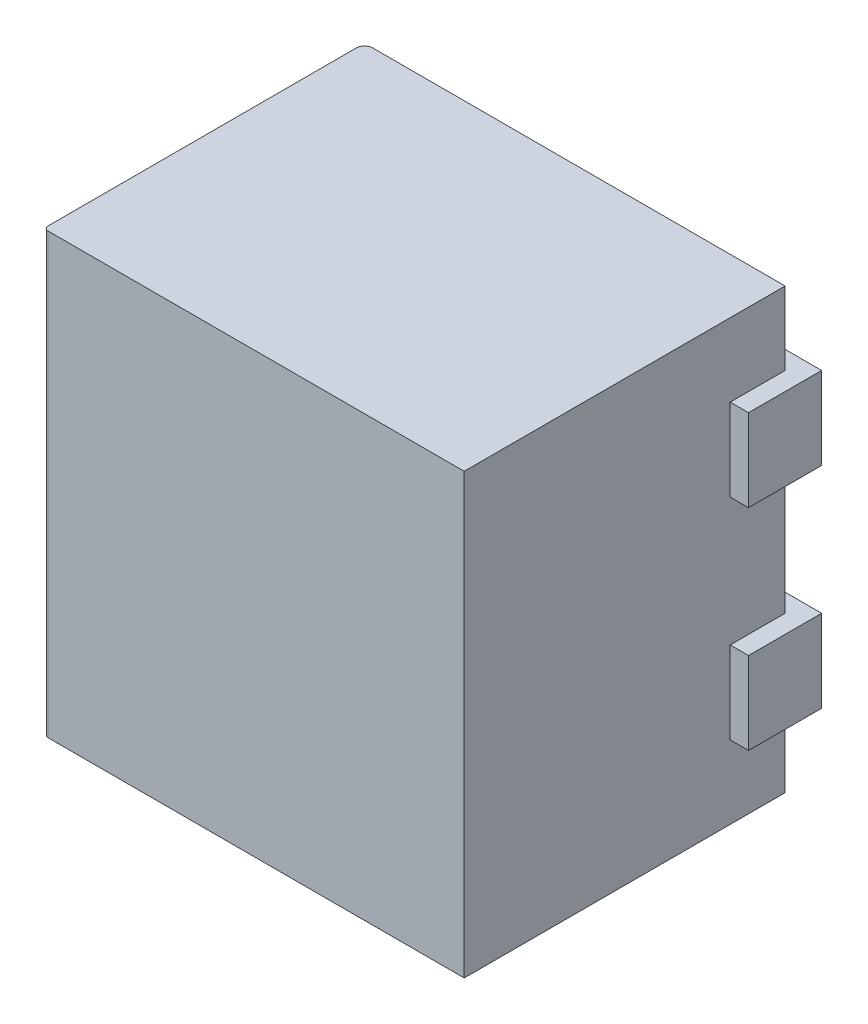
ISO-10303-21;
HEADER;
FILE_DESCRIPTION(('STEP AP214'),'2;1');
FILE_NAME('part.step','',(''),(''),'','','');
FILE_SCHEMA(('AUTOMOTIVE_DESIGN { 1 0 10303 214 1 1 1 1 }'));
ENDSEC;
DATA;
#1=APPLICATION_CONTEXT('core data for automotive mechanical design processes');
#2=APPLICATION_PROTOCOL_DEFINITION('international standard','automotive_design',2000,#1);
#3=PRODUCT_CONTEXT('',#1,'mechanical');
#4=PRODUCT('Part','Part','',(#3));
#5=PRODUCT_RELATED_PRODUCT_CATEGORY('part','',(#4));
#6=PRODUCT_DEFINITION_FORMATION('','',#4);
#7=PRODUCT_DEFINITION_CONTEXT('part definition',#1,'design');
#8=PRODUCT_DEFINITION('design','',#6,#7);
#9=PRODUCT_DEFINITION_SHAPE('','',#8);
#10=(LENGTH_UNIT() NAMED_UNIT(*) SI_UNIT(.MILLI.,.METRE.));
#11=(NAMED_UNIT(*) PLANE_ANGLE_UNIT() SI_UNIT($,.RADIAN.));
#12=(NAMED_UNIT(*) SI_UNIT($,.STERADIAN.) SOLID_ANGLE_UNIT());
#13=UNCERTAINTY_MEASURE_WITH_UNIT(LENGTH_MEASURE(1.E-05),#10,'distance_accuracy_value','');
#14=(GEOMETRIC_REPRESENTATION_CONTEXT(3) GLOBAL_UNCERTAINTY_ASSIGNED_CONTEXT((#13)) GLOBAL_UNIT_ASSIGNED_CONTEXT((#10,
#11,#12)) REPRESENTATION_CONTEXT('',''));
#15=CARTESIAN_POINT('',(0.,0.,0.));
#16=DIRECTION('',(0.,0.,1.));
#17=DIRECTION('',(1.,0.,0.));
#18=AXIS2_PLACEMENT_3D('',#15,#16,#17);
#19=CARTESIAN_POINT('',(-1.8,-1.2,2.6));
#20=DIRECTION('',(-1.,0.,0.));
#21=DIRECTION('',(0.,0.,1.));
#22=AXIS2_PLACEMENT_3D('',#19,#20,#21);
#23=CYLINDRICAL_SURFACE('',#22,0.725);
#24=DIRECTION('',(-1.,0.,0.));
#25=VECTOR('',#24,1.);
#26=CARTESIAN_POINT('',(-1.8,-1.4545718332089,1.92116409807918));
#27=LINE('',#26,#25);
#28=CARTESIAN_POINT('',(-1.8,-1.4545718332089,1.92116409807918));
#29=VERTEX_POINT('',#28);
#30=CARTESIAN_POINT('',(-2.29,-1.4545718332089,1.92116409807918));
#31=VERTEX_POINT('',#30);
#32=EDGE_CURVE('E237',#29,#31,#27,.T.);
#33=ORIENTED_EDGE('',*,*,#32,.T.);
#34=CARTESIAN_POINT('',(-2.29,-1.2,2.6));
#35=DIRECTION('',(-1.,0.,0.));
#36=DIRECTION('',(0.,0.,1.));
#37=AXIS2_PLACEMENT_3D('',#34,#35,#36);
#38=CIRCLE('',#37,0.725);
#39=CARTESIAN_POINT('',(-2.29,-0.521164098079176,2.8545718332089));
#40=VERTEX_POINT('',#39);
#41=EDGE_CURVE('E46',#40,#31,#38,.T.);
#42=ORIENTED_EDGE('',*,*,#41,.F.);
#43=DIRECTION('',(-1.,0.,0.));
#44=VECTOR('',#43,1.);
#45=CARTESIAN_POINT('',(-1.8,-0.521164098079176,2.8545718332089));
#46=LINE('',#45,#44);
#47=CARTESIAN_POINT('',(-1.8,-0.521164098079176,2.8545718332089));
#48=VERTEX_POINT('',#47);
#49=EDGE_CURVE('E235',#48,#40,#46,.T.);
#50=ORIENTED_EDGE('',*,*,#49,.F.);
#51=CARTESIAN_POINT('',(-1.8,-1.2,2.6));
#52=DIRECTION('',(-1.,0.,0.));
#53=DIRECTION('',(0.,0.,1.));
#54=AXIS2_PLACEMENT_3D('',#51,#52,#53);
#55=CIRCLE('',#54,0.725);
#56=EDGE_CURVE('E736',#48,#29,#55,.T.);
#57=ORIENTED_EDGE('',*,*,#56,.T.);
#58=EDGE_LOOP('',(#33,#42,#50,#57));
#59=FACE_BOUND('',#58,.T.);
#60=ADVANCED_FACE('F32',(#59),#23,.T.);
#61=CARTESIAN_POINT('',(-1.8,-1.4545718332089,1.92116409807918));
#62=DIRECTION('',(0.,-0.707106781186547,0.707106781186548));
#63=DIRECTION('',(0.,-0.707106781186548,-0.707106781186547));
#64=AXIS2_PLACEMENT_3D('',#61,#62,#63);
#65=PLANE('',#64);
#66=ORIENTED_EDGE('',*,*,#49,.T.);
#67=DIRECTION('',(0.,-0.707106781186548,-0.707106781186547));
#68=VECTOR('',#67,1.);
#69=CARTESIAN_POINT('',(-2.29,-1.4545718332089,1.92116409807918));
#70=LINE('',#69,#68);
#71=EDGE_CURVE('E225',#40,#31,#70,.T.);
#72=ORIENTED_EDGE('',*,*,#71,.T.);
#73=ORIENTED_EDGE('',*,*,#32,.F.);
#74=DIRECTION('',(0.,0.707106781186548,0.707106781186547));
#75=VECTOR('',#74,1.);
#76=CARTESIAN_POINT('',(-1.8,-1.4545718332089,1.92116409807918));
#77=LINE('',#76,#75);
#78=EDGE_CURVE('E241',#29,#48,#77,.T.);
#79=ORIENTED_EDGE('',*,*,#78,.T.);
#80=EDGE_LOOP('',(#66,#72,#73,#79));
#81=FACE_BOUND('',#80,.T.);
#82=ADVANCED_FACE('F239',(#81),#65,.T.);
#83=CARTESIAN_POINT('',(-1.8,-1.2,2.6));
#84=DIRECTION('',(-1.,0.,0.));
#85=DIRECTION('',(0.,0.,1.));
#86=AXIS2_PLACEMENT_3D('',#83,#84,#85);
#87=CYLINDRICAL_SURFACE('',#86,0.725);
#88=DIRECTION('',(-1.,0.,0.));
#89=VECTOR('',#88,1.);
#90=CARTESIAN_POINT('',(-1.8,-0.945428166791108,3.27883590192083));
#91=LINE('',#90,#89);
#92=CARTESIAN_POINT('',(-1.8,-0.945428166791108,3.27883590192083));
#93=VERTEX_POINT('',#92);
#94=CARTESIAN_POINT('',(-2.29,-0.945428166791108,3.27883590192083));
#95=VERTEX_POINT('',#94);
#96=EDGE_CURVE('E737',#93,#95,#91,.T.);
#97=ORIENTED_EDGE('',*,*,#96,.T.);
#98=CARTESIAN_POINT('',(-2.29,-1.87883590192083,2.34542816679111));
#99=VERTEX_POINT('',#98);
#100=EDGE_CURVE('E53',#99,#95,#38,.T.);
#101=ORIENTED_EDGE('',*,*,#100,.F.);
#102=DIRECTION('',(-1.,0.,0.));
#103=VECTOR('',#102,1.);
#104=CARTESIAN_POINT('',(-1.8,-1.87883590192083,2.34542816679111));
#105=LINE('',#104,#103);
#106=CARTESIAN_POINT('',(-1.8,-1.87883590192083,2.34542816679111));
#107=VERTEX_POINT('',#106);
#108=EDGE_CURVE('E731',#107,#99,#105,.T.);
#109=ORIENTED_EDGE('',*,*,#108,.F.);
#110=CARTESIAN_POINT('',(-1.8,-1.2,2.6));
#111=DIRECTION('',(-1.,0.,0.));
#112=DIRECTION('',(0.,0.,1.));
#113=AXIS2_PLACEMENT_3D('',#110,#111,#112);
#114=CIRCLE('',#113,0.725);
#115=EDGE_CURVE('E230',#107,#93,#114,.T.);
#116=ORIENTED_EDGE('',*,*,#115,.T.);
#117=EDGE_LOOP('',(#97,#101,#109,#116));
#118=FACE_BOUND('',#117,.T.);
#119=ADVANCED_FACE('F550',(#118),#87,.T.);
#120=CARTESIAN_POINT('',(-1.8,-1.87883590192083,2.34542816679111));
#121=DIRECTION('',(0.,0.707106781186547,-0.707106781186548));
#122=DIRECTION('',(0.,0.707106781186548,0.707106781186547));
#123=AXIS2_PLACEMENT_3D('',#120,#121,#122);
#124=PLANE('',#123);
#125=ORIENTED_EDGE('',*,*,#108,.T.);
#126=DIRECTION('',(0.,0.707106781186548,0.707106781186547));
#127=VECTOR('',#126,1.);
#128=CARTESIAN_POINT('',(-2.29,-1.87883590192083,2.34542816679111));
#129=LINE('',#128,#127);
#130=EDGE_CURVE('E11',#99,#95,#129,.T.);
#131=ORIENTED_EDGE('',*,*,#130,.T.);
#132=ORIENTED_EDGE('',*,*,#96,.F.);
#133=DIRECTION('',(0.,-0.707106781186548,-0.707106781186547));
#134=VECTOR('',#133,1.);
#135=CARTESIAN_POINT('',(-1.8,-1.87883590192083,2.34542816679111));
#136=LINE('',#135,#134);
#137=EDGE_CURVE('E734',#93,#107,#136,.T.);
#138=ORIENTED_EDGE('',*,*,#137,.T.);
#139=EDGE_LOOP('',(#125,#131,#132,#138));
#140=FACE_BOUND('',#139,.T.);
#141=ADVANCED_FACE('F649',(#140),#124,.T.);
#142=CARTESIAN_POINT('',(-2.25,2.4,3.46));
#143=DIRECTION('',(0.,-1.,0.));
#144=DIRECTION('',(0.,0.,-1.));
#145=AXIS2_PLACEMENT_3D('',#142,#143,#144);
#146=CYLINDRICAL_SURFACE('',#145,0.05);
#147=DIRECTION('',(0.,-1.,0.));
#148=VECTOR('',#147,1.);
#149=CARTESIAN_POINT('',(-2.25,2.4,3.51));
#150=LINE('',#149,#148);
#151=CARTESIAN_POINT('',(-2.25,2.4,3.51));
#152=VERTEX_POINT('',#151);
#153=CARTESIAN_POINT('',(-2.25,-2.4,3.51));
#154=VERTEX_POINT('',#153);
#155=EDGE_CURVE('E436',#152,#154,#150,.T.);
#156=ORIENTED_EDGE('',*,*,#155,.F.);
#157=CARTESIAN_POINT('',(-2.25,2.4,3.46));
#158=DIRECTION('',(0.,-1.,0.));
#159=DIRECTION('',(0.,0.,-1.));
#160=AXIS2_PLACEMENT_3D('',#157,#158,#159);
#161=CIRCLE('',#160,0.05);
#162=CARTESIAN_POINT('',(-2.3,2.4,3.46));
#163=VERTEX_POINT('',#162);
#164=EDGE_CURVE('E442',#163,#152,#161,.F.);
#165=ORIENTED_EDGE('',*,*,#164,.F.);
#166=DIRECTION('',(0.,-1.,0.));
#167=VECTOR('',#166,1.);
#168=CARTESIAN_POINT('',(-2.3,-2.4,3.46));
#169=LINE('',#168,#167);
#170=CARTESIAN_POINT('',(-2.3,-2.4,3.46));
#171=VERTEX_POINT('',#170);
#172=EDGE_CURVE('E439',#171,#163,#169,.F.);
#173=ORIENTED_EDGE('',*,*,#172,.F.);
#174=CARTESIAN_POINT('',(-2.25,-2.4,3.46));
#175=DIRECTION('',(0.,1.,0.));
#176=DIRECTION('',(0.,0.,1.));
#177=AXIS2_PLACEMENT_3D('',#174,#175,#176);
#178=CIRCLE('',#177,0.05);
#179=EDGE_CURVE('E40',#154,#171,#178,.F.);
#180=ORIENTED_EDGE('',*,*,#179,.F.);
#181=EDGE_LOOP('',(#156,#165,#173,#180));
#182=FACE_BOUND('',#181,.T.);
#183=ADVANCED_FACE('F34',(#182),#146,.T.);
#184=CARTESIAN_POINT('',(-2.35,0.65,-0.05));
#185=DIRECTION('',(0.,-1.,0.));
#186=DIRECTION('',(0.,0.,-1.));
#187=AXIS2_PLACEMENT_3D('',#184,#185,#186);
#188=CYLINDRICAL_SURFACE('',#187,0.15);
#189=DIRECTION('',(0.,1.,0.));
#190=VECTOR('',#189,1.);
#191=CARTESIAN_POINT('',(-2.35,0.65,-0.2));
#192=LINE('',#191,#190);
#193=CARTESIAN_POINT('',(-2.35,-0.65,-0.2));
#194=VERTEX_POINT('',#193);
#195=CARTESIAN_POINT('',(-2.35,0.65,-0.2));
#196=VERTEX_POINT('',#195);
#197=EDGE_CURVE('E426',#194,#196,#192,.T.);
#198=ORIENTED_EDGE('',*,*,#197,.F.);
#199=CARTESIAN_POINT('',(-2.35,-0.65,-0.05));
#200=DIRECTION('',(0.,1.,0.));
#201=DIRECTION('',(0.,0.,1.));
#202=AXIS2_PLACEMENT_3D('',#199,#200,#201);
#203=CIRCLE('',#202,0.15);
#204=CARTESIAN_POINT('',(-2.5,-0.65,-0.0499999999999997));
#205=VERTEX_POINT('',#204);
#206=EDGE_CURVE('E432',#205,#194,#203,.F.);
#207=ORIENTED_EDGE('',*,*,#206,.F.);
#208=DIRECTION('',(0.,1.,0.));
#209=VECTOR('',#208,1.);
#210=CARTESIAN_POINT('',(-2.5,0.65,-0.05));
#211=LINE('',#210,#209);
#212=CARTESIAN_POINT('',(-2.5,0.65,-0.0499999999999997));
#213=VERTEX_POINT('',#212);
#214=EDGE_CURVE('E429',#213,#205,#211,.F.);
#215=ORIENTED_EDGE('',*,*,#214,.F.);
#216=CARTESIAN_POINT('',(-2.35,0.65,-0.05));
#217=DIRECTION('',(0.,-1.,0.));
#218=DIRECTION('',(0.,0.,-1.));
#219=AXIS2_PLACEMENT_3D('',#216,#217,#218);
#220=CIRCLE('',#219,0.15);
#221=EDGE_CURVE('E434',#196,#213,#220,.F.);
#222=ORIENTED_EDGE('',*,*,#221,.F.);
#223=EDGE_LOOP('',(#198,#207,#215,#222));
#224=FACE_BOUND('',#223,.T.);
#225=ADVANCED_FACE('F532',(#224),#188,.T.);
#226=CARTESIAN_POINT('',(-2.3,2.4,0.));
#227=DIRECTION('',(0.,0.,-1.));
#228=DIRECTION('',(-1.,0.,0.));
#229=AXIS2_PLACEMENT_3D('',#226,#227,#228);
#230=PLANE('',#229);
#231=DIRECTION('',(0.,-1.,0.));
#232=VECTOR('',#231,1.);
#233=CARTESIAN_POINT('',(1.5,2.4,0.));
#234=LINE('',#233,#232);
#235=CARTESIAN_POINT('',(1.5,-0.7,0.));
#236=VERTEX_POINT('',#235);
#237=CARTESIAN_POINT('',(1.5,-1.6,0.));
#238=VERTEX_POINT('',#237);
#239=EDGE_CURVE('E424',#236,#238,#234,.T.);
#240=ORIENTED_EDGE('',*,*,#239,.T.);
#241=DIRECTION('',(1.,0.,0.));
#242=VECTOR('',#241,1.);
#243=CARTESIAN_POINT('',(-2.3,-1.6,0.));
#244=LINE('',#243,#242);
#245=CARTESIAN_POINT('',(2.3,-1.6,0.));
#246=VERTEX_POINT('',#245);
#247=EDGE_CURVE('E282',#238,#246,#244,.T.);
#248=ORIENTED_EDGE('',*,*,#247,.T.);
#249=DIRECTION('',(0.,1.,0.));
#250=VECTOR('',#249,1.);
#251=CARTESIAN_POINT('',(2.3,2.4,0.));
#252=LINE('',#251,#250);
#253=CARTESIAN_POINT('',(2.3,-2.4,0.));
#254=VERTEX_POINT('',#253);
#255=EDGE_CURVE('E365',#254,#246,#252,.T.);
#256=ORIENTED_EDGE('',*,*,#255,.F.);
#257=DIRECTION('',(1.,0.,0.));
#258=VECTOR('',#257,1.);
#259=CARTESIAN_POINT('',(2.3,-2.4,0.));
#260=LINE('',#259,#258);
#261=CARTESIAN_POINT('',(-2.21,-2.4,0.));
#262=VERTEX_POINT('',#261);
#263=EDGE_CURVE('E353',#262,#254,#260,.T.);
#264=ORIENTED_EDGE('',*,*,#263,.F.);
#265=DIRECTION('',(0.,1.,0.));
#266=VECTOR('',#265,1.);
#267=CARTESIAN_POINT('',(-2.21,2.4,0.));
#268=LINE('',#267,#266);
#269=CARTESIAN_POINT('',(-2.21,-0.65,0.));
#270=VERTEX_POINT('',#269);
#271=EDGE_CURVE('E381',#262,#270,#268,.T.);
#272=ORIENTED_EDGE('',*,*,#271,.T.);
#273=DIRECTION('',(1.,0.,0.));
#274=VECTOR('',#273,1.);
#275=CARTESIAN_POINT('',(-2.3,-0.65,0.));
#276=LINE('',#275,#274);
#277=CARTESIAN_POINT('',(-1.36,-0.65,0.));
#278=VERTEX_POINT('',#277);
#279=EDGE_CURVE('E399',#270,#278,#276,.T.);
#280=ORIENTED_EDGE('',*,*,#279,.T.);
#281=DIRECTION('',(0.,1.,0.));
#282=VECTOR('',#281,1.);
#283=CARTESIAN_POINT('',(-1.36,2.4,0.));
#284=LINE('',#283,#282);
#285=CARTESIAN_POINT('',(-1.36,0.65,0.));
#286=VERTEX_POINT('',#285);
#287=EDGE_CURVE('E396',#278,#286,#284,.T.);
#288=ORIENTED_EDGE('',*,*,#287,.T.);
#289=DIRECTION('',(-1.,0.,0.));
#290=VECTOR('',#289,1.);
#291=CARTESIAN_POINT('',(-2.3,0.65,0.));
#292=LINE('',#291,#290);
#293=CARTESIAN_POINT('',(-2.21,0.65,0.));
#294=VERTEX_POINT('',#293);
#295=EDGE_CURVE('E393',#286,#294,#292,.T.);
#296=ORIENTED_EDGE('',*,*,#295,.T.);
#297=CARTESIAN_POINT('',(-2.21,2.4,0.));
#298=VERTEX_POINT('',#297);
#299=EDGE_CURVE('E380',#294,#298,#268,.T.);
#300=ORIENTED_EDGE('',*,*,#299,.T.);
#301=DIRECTION('',(-1.,0.,0.));
#302=VECTOR('',#301,1.);
#303=CARTESIAN_POINT('',(-2.3,2.4,0.));
#304=LINE('',#303,#302);
#305=CARTESIAN_POINT('',(2.3,2.4,0.));
#306=VERTEX_POINT('',#305);
#307=EDGE_CURVE('E357',#306,#298,#304,.T.);
#308=ORIENTED_EDGE('',*,*,#307,.F.);
#309=CARTESIAN_POINT('',(2.3,1.6,0.));
#310=VERTEX_POINT('',#309);
#311=EDGE_CURVE('E364',#310,#306,#252,.T.);
#312=ORIENTED_EDGE('',*,*,#311,.F.);
#313=DIRECTION('',(-1.,0.,0.));
#314=VECTOR('',#313,1.);
#315=CARTESIAN_POINT('',(-2.3,1.6,0.));
#316=LINE('',#315,#314);
#317=CARTESIAN_POINT('',(1.5,1.6,0.));
#318=VERTEX_POINT('',#317);
#319=EDGE_CURVE('E311',#310,#318,#316,.T.);
#320=ORIENTED_EDGE('',*,*,#319,.T.);
#321=DIRECTION('',(0.,-1.,0.));
#322=VECTOR('',#321,1.);
#323=CARTESIAN_POINT('',(1.5,2.4,0.));
#324=LINE('',#323,#322);
#325=CARTESIAN_POINT('',(1.5,0.7,0.));
#326=VERTEX_POINT('',#325);
#327=EDGE_CURVE('E413',#318,#326,#324,.T.);
#328=ORIENTED_EDGE('',*,*,#327,.T.);
#329=DIRECTION('',(1.,0.,0.));
#330=VECTOR('',#329,1.);
#331=CARTESIAN_POINT('',(-2.3,0.7,0.));
#332=LINE('',#331,#330);
#333=CARTESIAN_POINT('',(2.3,0.7,0.));
#334=VERTEX_POINT('',#333);
#335=EDGE_CURVE('E313',#326,#334,#332,.T.);
#336=ORIENTED_EDGE('',*,*,#335,.T.);
#337=CARTESIAN_POINT('',(2.3,-0.7,0.));
#338=VERTEX_POINT('',#337);
#339=EDGE_CURVE('E368',#338,#334,#252,.T.);
#340=ORIENTED_EDGE('',*,*,#339,.F.);
#341=DIRECTION('',(-1.,0.,0.));
#342=VECTOR('',#341,1.);
#343=CARTESIAN_POINT('',(-2.3,-0.7,0.));
#344=LINE('',#343,#342);
#345=EDGE_CURVE('E280',#338,#236,#344,.T.);
#346=ORIENTED_EDGE('',*,*,#345,.T.);
#347=EDGE_LOOP('',(#240,#248,#256,#264,#272,#280,#288,#296,#300,#308,#312,#320,#328,#336,#340,#346));
#348=FACE_BOUND('',#347,.T.);
#349=ADVANCED_FACE('F469',(#348),#230,.T.);
#350=CARTESIAN_POINT('',(2.3,2.4,3.51));
#351=DIRECTION('',(-1.,0.,0.));
#352=DIRECTION('',(0.,0.,1.));
#353=AXIS2_PLACEMENT_3D('',#350,#351,#352);
#354=PLANE('',#353);
#355=DIRECTION('',(0.,0.,-1.));
#356=VECTOR('',#355,1.);
#357=CARTESIAN_POINT('',(2.3,-1.6,3.51));
#358=LINE('',#357,#356);
#359=CARTESIAN_POINT('',(2.3,-1.6,0.6));
#360=VERTEX_POINT('',#359);
#361=EDGE_CURVE('E421',#360,#246,#358,.T.);
#362=ORIENTED_EDGE('',*,*,#361,.F.);
#363=DIRECTION('',(0.,-1.,0.));
#364=VECTOR('',#363,1.);
#365=CARTESIAN_POINT('',(2.3,2.4,0.6));
#366=LINE('',#365,#364);
#367=CARTESIAN_POINT('',(2.3,-0.7,0.6));
#368=VERTEX_POINT('',#367);
#369=EDGE_CURVE('E415',#368,#360,#366,.T.);
#370=ORIENTED_EDGE('',*,*,#369,.F.);
#371=DIRECTION('',(0.,0.,1.));
#372=VECTOR('',#371,1.);
#373=CARTESIAN_POINT('',(2.3,-0.7,3.51));
#374=LINE('',#373,#372);
#375=EDGE_CURVE('E418',#338,#368,#374,.T.);
#376=ORIENTED_EDGE('',*,*,#375,.F.);
#377=ORIENTED_EDGE('',*,*,#339,.T.);
#378=DIRECTION('',(0.,0.,-1.));
#379=VECTOR('',#378,1.);
#380=CARTESIAN_POINT('',(2.3,0.7,3.51));
#381=LINE('',#380,#379);
#382=CARTESIAN_POINT('',(2.3,0.7,0.6));
#383=VERTEX_POINT('',#382);
#384=EDGE_CURVE('E410',#383,#334,#381,.T.);
#385=ORIENTED_EDGE('',*,*,#384,.F.);
#386=DIRECTION('',(0.,-1.,0.));
#387=VECTOR('',#386,1.);
#388=CARTESIAN_POINT('',(2.3,2.4,0.6));
#389=LINE('',#388,#387);
#390=CARTESIAN_POINT('',(2.3,1.6,0.6));
#391=VERTEX_POINT('',#390);
#392=EDGE_CURVE('E404',#391,#383,#389,.T.);
#393=ORIENTED_EDGE('',*,*,#392,.F.);
#394=DIRECTION('',(0.,0.,1.));
#395=VECTOR('',#394,1.);
#396=CARTESIAN_POINT('',(2.3,1.6,3.51));
#397=LINE('',#396,#395);
#398=EDGE_CURVE('E407',#310,#391,#397,.T.);
#399=ORIENTED_EDGE('',*,*,#398,.F.);
#400=ORIENTED_EDGE('',*,*,#311,.T.);
#401=DIRECTION('',(0.,0.,-1.));
#402=VECTOR('',#401,1.);
#403=CARTESIAN_POINT('',(2.3,2.4,3.51));
#404=LINE('',#403,#402);
#405=CARTESIAN_POINT('',(2.3,2.4,3.51));
#406=VERTEX_POINT('',#405);
#407=EDGE_CURVE('E372',#406,#306,#404,.T.);
#408=ORIENTED_EDGE('',*,*,#407,.F.);
#409=DIRECTION('',(0.,1.,0.));
#410=VECTOR('',#409,1.);
#411=CARTESIAN_POINT('',(2.3,2.4,3.51));
#412=LINE('',#411,#410);
#413=CARTESIAN_POINT('',(2.3,-2.4,3.51));
#414=VERTEX_POINT('',#413);
#415=EDGE_CURVE('E356',#414,#406,#412,.T.);
#416=ORIENTED_EDGE('',*,*,#415,.F.);
#417=DIRECTION('',(0.,0.,-1.));
#418=VECTOR('',#417,1.);
#419=CARTESIAN_POINT('',(2.3,-2.4,3.51));
#420=LINE('',#419,#418);
#421=EDGE_CURVE('E375',#414,#254,#420,.T.);
#422=ORIENTED_EDGE('',*,*,#421,.T.);
#423=ORIENTED_EDGE('',*,*,#255,.T.);
#424=EDGE_LOOP('',(#362,#370,#376,#377,#385,#393,#399,#400,#408,#416,#422,#423));
#425=FACE_BOUND('',#424,.T.);
#426=ADVANCED_FACE('F467',(#425),#354,.F.);
#427=CARTESIAN_POINT('',(-2.21,2.4,0.09));
#428=DIRECTION('',(0.,-1.,0.));
#429=DIRECTION('',(0.,0.,-1.));
#430=AXIS2_PLACEMENT_3D('',#427,#428,#429);
#431=CYLINDRICAL_SURFACE('',#430,0.09);
#432=DIRECTION('',(0.,1.,0.));
#433=VECTOR('',#432,1.);
#434=CARTESIAN_POINT('',(-2.3,2.4,0.09));
#435=LINE('',#434,#433);
#436=CARTESIAN_POINT('',(-2.3,-0.65,0.0900000000000002));
#437=VERTEX_POINT('',#436);
#438=CARTESIAN_POINT('',(-2.3,-2.4,0.0900000000000002));
#439=VERTEX_POINT('',#438);
#440=EDGE_CURVE('E384',#437,#439,#435,.F.);
#441=ORIENTED_EDGE('',*,*,#440,.F.);
#442=CARTESIAN_POINT('',(-2.21,-0.65,0.09));
#443=DIRECTION('',(0.,1.,0.));
#444=DIRECTION('',(0.,0.,1.));
#445=AXIS2_PLACEMENT_3D('',#442,#443,#444);
#446=CIRCLE('',#445,0.09);
#447=EDGE_CURVE('E348',#437,#270,#446,.F.);
#448=ORIENTED_EDGE('',*,*,#447,.T.);
#449=ORIENTED_EDGE('',*,*,#271,.F.);
#450=CARTESIAN_POINT('',(-2.21,-2.4,0.09));
#451=DIRECTION('',(0.,1.,0.));
#452=DIRECTION('',(0.,0.,1.));
#453=AXIS2_PLACEMENT_3D('',#450,#451,#452);
#454=CIRCLE('',#453,0.09);
#455=EDGE_CURVE('E388',#439,#262,#454,.F.);
#456=ORIENTED_EDGE('',*,*,#455,.F.);
#457=EDGE_LOOP('',(#441,#448,#449,#456));
#458=FACE_BOUND('',#457,.T.);
#459=ADVANCED_FACE('F461',(#458),#431,.T.);
#460=ORIENTED_EDGE('',*,*,#299,.F.);
#461=CARTESIAN_POINT('',(-2.21,0.65,0.09));
#462=DIRECTION('',(0.,-1.,0.));
#463=DIRECTION('',(0.,0.,-1.));
#464=AXIS2_PLACEMENT_3D('',#461,#462,#463);
#465=CIRCLE('',#464,0.09);
#466=CARTESIAN_POINT('',(-2.3,0.65,0.0900000000000002));
#467=VERTEX_POINT('',#466);
#468=EDGE_CURVE('E343',#294,#467,#465,.F.);
#469=ORIENTED_EDGE('',*,*,#468,.T.);
#470=CARTESIAN_POINT('',(-2.3,2.4,0.0900000000000002));
#471=VERTEX_POINT('',#470);
#472=EDGE_CURVE('E385',#471,#467,#435,.F.);
#473=ORIENTED_EDGE('',*,*,#472,.F.);
#474=CARTESIAN_POINT('',(-2.21,2.4,0.09));
#475=DIRECTION('',(0.,-1.,0.));
#476=DIRECTION('',(0.,0.,-1.));
#477=AXIS2_PLACEMENT_3D('',#474,#475,#476);
#478=CIRCLE('',#477,0.09);
#479=EDGE_CURVE('E390',#298,#471,#478,.F.);
#480=ORIENTED_EDGE('',*,*,#479,.F.);
#481=EDGE_LOOP('',(#460,#469,#473,#480));
#482=FACE_BOUND('',#481,.T.);
#483=ADVANCED_FACE('F508',(#482),#431,.T.);
#484=CARTESIAN_POINT('',(-2.3,-2.4,3.51));
#485=DIRECTION('',(1.,0.,0.));
#486=DIRECTION('',(0.,0.,-1.));
#487=AXIS2_PLACEMENT_3D('',#484,#485,#486);
#488=PLANE('',#487);
#489=CARTESIAN_POINT('',(-2.3,-1.2,2.6));
#490=DIRECTION('',(-1.,0.,0.));
#491=DIRECTION('',(0.,0.,1.));
#492=AXIS2_PLACEMENT_3D('',#489,#490,#491);
#493=CIRCLE('',#492,0.75);
#494=CARTESIAN_POINT('',(-2.3,-1.2,3.35));
#495=VERTEX_POINT('',#494);
#496=EDGE_CURVE('E242',#495,#495,#493,.T.);
#497=ORIENTED_EDGE('',*,*,#496,.F.);
#498=EDGE_LOOP('',(#497));
#499=FACE_BOUND('',#498,.T.);
#500=DIRECTION('',(0.,0.,-1.));
#501=VECTOR('',#500,1.);
#502=CARTESIAN_POINT('',(-2.3,-2.4,3.51));
#503=LINE('',#502,#501);
#504=EDGE_CURVE('E378',#171,#439,#503,.T.);
#505=ORIENTED_EDGE('',*,*,#504,.F.);
#506=ORIENTED_EDGE('',*,*,#172,.T.);
#507=DIRECTION('',(0.,0.,-1.));
#508=VECTOR('',#507,1.);
#509=CARTESIAN_POINT('',(-2.3,2.4,3.51));
#510=LINE('',#509,#508);
#511=EDGE_CURVE('E362',#163,#471,#510,.T.);
#512=ORIENTED_EDGE('',*,*,#511,.T.);
#513=ORIENTED_EDGE('',*,*,#472,.T.);
#514=DIRECTION('',(0.,0.,-1.));
#515=VECTOR('',#514,1.);
#516=CARTESIAN_POINT('',(-2.3,0.65,3.51));
#517=LINE('',#516,#515);
#518=CARTESIAN_POINT('',(-2.3,0.65,0.6));
#519=VERTEX_POINT('',#518);
#520=EDGE_CURVE('E346',#519,#467,#517,.T.);
#521=ORIENTED_EDGE('',*,*,#520,.F.);
#522=DIRECTION('',(0.,1.,0.));
#523=VECTOR('',#522,1.);
#524=CARTESIAN_POINT('',(-2.3,-2.4,0.6));
#525=LINE('',#524,#523);
#526=CARTESIAN_POINT('',(-2.3,-0.65,0.6));
#527=VERTEX_POINT('',#526);
#528=EDGE_CURVE('E402',#527,#519,#525,.T.);
#529=ORIENTED_EDGE('',*,*,#528,.F.);
#530=DIRECTION('',(0.,0.,1.));
#531=VECTOR('',#530,1.);
#532=CARTESIAN_POINT('',(-2.3,-0.65,3.51));
#533=LINE('',#532,#531);
#534=EDGE_CURVE('E351',#437,#527,#533,.T.);
#535=ORIENTED_EDGE('',*,*,#534,.F.);
#536=ORIENTED_EDGE('',*,*,#440,.T.);
#537=EDGE_LOOP('',(#505,#506,#512,#513,#521,#529,#535,#536));
#538=FACE_BOUND('',#537,.T.);
#539=ADVANCED_FACE('F454',(#499,#538),#488,.F.);
#540=CARTESIAN_POINT('',(2.3,-2.4,3.51));
#541=DIRECTION('',(0.,1.,0.));
#542=DIRECTION('',(0.,0.,1.));
#543=AXIS2_PLACEMENT_3D('',#540,#541,#542);
#544=PLANE('',#543);
#545=DIRECTION('',(1.,0.,0.));
#546=VECTOR('',#545,1.);
#547=CARTESIAN_POINT('',(2.3,-2.4,3.51));
#548=LINE('',#547,#546);
#549=EDGE_CURVE('E354',#154,#414,#548,.T.);
#550=ORIENTED_EDGE('',*,*,#549,.F.);
#551=ORIENTED_EDGE('',*,*,#179,.T.);
#552=ORIENTED_EDGE('',*,*,#504,.T.);
#553=ORIENTED_EDGE('',*,*,#455,.T.);
#554=ORIENTED_EDGE('',*,*,#263,.T.);
#555=ORIENTED_EDGE('',*,*,#421,.F.);
#556=EDGE_LOOP('',(#550,#551,#552,#553,#554,#555));
#557=FACE_BOUND('',#556,.T.);
#558=ADVANCED_FACE('F446',(#557),#544,.F.);
#559=CARTESIAN_POINT('',(-2.3,2.4,3.51));
#560=DIRECTION('',(0.,-1.,0.));
#561=DIRECTION('',(0.,0.,-1.));
#562=AXIS2_PLACEMENT_3D('',#559,#560,#561);
#563=PLANE('',#562);
#564=ORIENTED_EDGE('',*,*,#511,.F.);
#565=ORIENTED_EDGE('',*,*,#164,.T.);
#566=DIRECTION('',(-1.,0.,0.));
#567=VECTOR('',#566,1.);
#568=CARTESIAN_POINT('',(-2.3,2.4,3.51));
#569=LINE('',#568,#567);
#570=EDGE_CURVE('E359',#406,#152,#569,.T.);
#571=ORIENTED_EDGE('',*,*,#570,.F.);
#572=ORIENTED_EDGE('',*,*,#407,.T.);
#573=ORIENTED_EDGE('',*,*,#307,.T.);
#574=ORIENTED_EDGE('',*,*,#479,.T.);
#575=EDGE_LOOP('',(#564,#565,#571,#572,#573,#574));
#576=FACE_BOUND('',#575,.T.);
#577=ADVANCED_FACE('F503',(#576),#563,.F.);
#578=CARTESIAN_POINT('',(-2.3,2.4,3.51));
#579=DIRECTION('',(0.,0.,-1.));
#580=DIRECTION('',(-1.,0.,0.));
#581=AXIS2_PLACEMENT_3D('',#578,#579,#580);
#582=PLANE('',#581);
#583=ORIENTED_EDGE('',*,*,#570,.T.);
#584=ORIENTED_EDGE('',*,*,#155,.T.);
#585=ORIENTED_EDGE('',*,*,#549,.T.);
#586=ORIENTED_EDGE('',*,*,#415,.T.);
#587=EDGE_LOOP('',(#583,#584,#585,#586));
#588=FACE_BOUND('',#587,.T.);
#589=ADVANCED_FACE('F601',(#588),#582,.F.);
#590=CARTESIAN_POINT('',(-2.5,0.65,0.6));
#591=DIRECTION('',(0.,0.,-1.));
#592=DIRECTION('',(-1.,0.,0.));
#593=AXIS2_PLACEMENT_3D('',#590,#591,#592);
#594=PLANE('',#593);
#595=DIRECTION('',(1.,0.,0.));
#596=VECTOR('',#595,1.);
#597=CARTESIAN_POINT('',(-1.36,-0.65,0.6));
#598=LINE('',#597,#596);
#599=CARTESIAN_POINT('',(-2.5,-0.65,0.6));
#600=VERTEX_POINT('',#599);
#601=EDGE_CURVE('E320',#600,#527,#598,.T.);
#602=ORIENTED_EDGE('',*,*,#601,.T.);
#603=ORIENTED_EDGE('',*,*,#528,.T.);
#604=DIRECTION('',(-1.,0.,0.));
#605=VECTOR('',#604,1.);
#606=CARTESIAN_POINT('',(-2.5,0.65,0.6));
#607=LINE('',#606,#605);
#608=CARTESIAN_POINT('',(-2.5,0.65,0.6));
#609=VERTEX_POINT('',#608);
#610=EDGE_CURVE('E324',#519,#609,#607,.T.);
#611=ORIENTED_EDGE('',*,*,#610,.T.);
#612=DIRECTION('',(0.,-1.,0.));
#613=VECTOR('',#612,1.);
#614=CARTESIAN_POINT('',(-2.5,-0.65,0.6));
#615=LINE('',#614,#613);
#616=EDGE_CURVE('E317',#609,#600,#615,.T.);
#617=ORIENTED_EDGE('',*,*,#616,.T.);
#618=EDGE_LOOP('',(#602,#603,#611,#617));
#619=FACE_BOUND('',#618,.T.);
#620=ADVANCED_FACE('F516',(#619),#594,.F.);
#621=CARTESIAN_POINT('',(-1.36,-0.65,0.6));
#622=DIRECTION('',(0.,1.,0.));
#623=DIRECTION('',(0.,0.,1.));
#624=AXIS2_PLACEMENT_3D('',#621,#622,#623);
#625=PLANE('',#624);
#626=DIRECTION('',(0.,0.,-1.));
#627=VECTOR('',#626,1.);
#628=CARTESIAN_POINT('',(-2.5,-0.65,0.6));
#629=LINE('',#628,#627);
#630=EDGE_CURVE('E340',#600,#205,#629,.T.);
#631=ORIENTED_EDGE('',*,*,#630,.T.);
#632=ORIENTED_EDGE('',*,*,#206,.T.);
#633=DIRECTION('',(1.,0.,0.));
#634=VECTOR('',#633,1.);
#635=CARTESIAN_POINT('',(-1.36,-0.65,-0.2));
#636=LINE('',#635,#634);
#637=CARTESIAN_POINT('',(-1.36,-0.65,-0.2));
#638=VERTEX_POINT('',#637);
#639=EDGE_CURVE('E316',#194,#638,#636,.T.);
#640=ORIENTED_EDGE('',*,*,#639,.T.);
#641=DIRECTION('',(0.,0.,-1.));
#642=VECTOR('',#641,1.);
#643=CARTESIAN_POINT('',(-1.36,-0.65,0.6));
#644=LINE('',#643,#642);
#645=EDGE_CURVE('E337',#278,#638,#644,.T.);
#646=ORIENTED_EDGE('',*,*,#645,.F.);
#647=ORIENTED_EDGE('',*,*,#279,.F.);
#648=ORIENTED_EDGE('',*,*,#447,.F.);
#649=ORIENTED_EDGE('',*,*,#534,.T.);
#650=ORIENTED_EDGE('',*,*,#601,.F.);
#651=EDGE_LOOP('',(#631,#632,#640,#646,#647,#648,#649,#650));
#652=FACE_BOUND('',#651,.T.);
#653=ADVANCED_FACE('F519',(#652),#625,.F.);
#654=CARTESIAN_POINT('',(-2.5,0.65,0.6));
#655=DIRECTION('',(0.,-1.,0.));
#656=DIRECTION('',(0.,0.,-1.));
#657=AXIS2_PLACEMENT_3D('',#654,#655,#656);
#658=PLANE('',#657);
#659=DIRECTION('',(-1.,0.,0.));
#660=VECTOR('',#659,1.);
#661=CARTESIAN_POINT('',(-2.5,0.65,-0.2));
#662=LINE('',#661,#660);
#663=CARTESIAN_POINT('',(-1.36,0.65,-0.2));
#664=VERTEX_POINT('',#663);
#665=EDGE_CURVE('E321',#664,#196,#662,.T.);
#666=ORIENTED_EDGE('',*,*,#665,.T.);
#667=ORIENTED_EDGE('',*,*,#221,.T.);
#668=DIRECTION('',(0.,0.,-1.));
#669=VECTOR('',#668,1.);
#670=CARTESIAN_POINT('',(-2.5,0.65,0.6));
#671=LINE('',#670,#669);
#672=EDGE_CURVE('E326',#609,#213,#671,.T.);
#673=ORIENTED_EDGE('',*,*,#672,.F.);
#674=ORIENTED_EDGE('',*,*,#610,.F.);
#675=ORIENTED_EDGE('',*,*,#520,.T.);
#676=ORIENTED_EDGE('',*,*,#468,.F.);
#677=ORIENTED_EDGE('',*,*,#295,.F.);
#678=DIRECTION('',(0.,0.,-1.));
#679=VECTOR('',#678,1.);
#680=CARTESIAN_POINT('',(-1.36,0.65,0.6));
#681=LINE('',#680,#679);
#682=EDGE_CURVE('E335',#286,#664,#681,.T.);
#683=ORIENTED_EDGE('',*,*,#682,.T.);
#684=EDGE_LOOP('',(#666,#667,#673,#674,#675,#676,#677,#683));
#685=FACE_BOUND('',#684,.T.);
#686=ADVANCED_FACE('F512',(#685),#658,.F.);
#687=CARTESIAN_POINT('',(-2.5,-0.65,0.6));
#688=DIRECTION('',(1.,0.,0.));
#689=DIRECTION('',(0.,0.,-1.));
#690=AXIS2_PLACEMENT_3D('',#687,#688,#689);
#691=PLANE('',#690);
#692=ORIENTED_EDGE('',*,*,#672,.T.);
#693=ORIENTED_EDGE('',*,*,#214,.T.);
#694=ORIENTED_EDGE('',*,*,#630,.F.);
#695=ORIENTED_EDGE('',*,*,#616,.F.);
#696=EDGE_LOOP('',(#692,#693,#694,#695));
#697=FACE_BOUND('',#696,.T.);
#698=ADVANCED_FACE('F534',(#697),#691,.F.);
#699=CARTESIAN_POINT('',(-1.36,0.65,0.6));
#700=DIRECTION('',(-1.,0.,0.));
#701=DIRECTION('',(0.,0.,1.));
#702=AXIS2_PLACEMENT_3D('',#699,#700,#701);
#703=PLANE('',#702);
#704=ORIENTED_EDGE('',*,*,#287,.F.);
#705=ORIENTED_EDGE('',*,*,#645,.T.);
#706=DIRECTION('',(0.,1.,0.));
#707=VECTOR('',#706,1.);
#708=CARTESIAN_POINT('',(-1.36,0.65,-0.2));
#709=LINE('',#708,#707);
#710=EDGE_CURVE('E328',#638,#664,#709,.T.);
#711=ORIENTED_EDGE('',*,*,#710,.T.);
#712=ORIENTED_EDGE('',*,*,#682,.F.);
#713=EDGE_LOOP('',(#704,#705,#711,#712));
#714=FACE_BOUND('',#713,.T.);
#715=ADVANCED_FACE('F523',(#714),#703,.F.);
#716=CARTESIAN_POINT('',(-2.5,0.65,-0.2));
#717=DIRECTION('',(0.,0.,-1.));
#718=DIRECTION('',(-1.,0.,0.));
#719=AXIS2_PLACEMENT_3D('',#716,#717,#718);
#720=PLANE('',#719);
#721=ORIENTED_EDGE('',*,*,#639,.F.);
#722=ORIENTED_EDGE('',*,*,#197,.T.);
#723=ORIENTED_EDGE('',*,*,#665,.F.);
#724=ORIENTED_EDGE('',*,*,#710,.F.);
#725=EDGE_LOOP('',(#721,#722,#723,#724));
#726=FACE_BOUND('',#725,.T.);
#727=ADVANCED_FACE('F528',(#726),#720,.T.);
#728=CARTESIAN_POINT('',(1.5,1.6,0.6));
#729=DIRECTION('',(0.,0.,-1.));
#730=DIRECTION('',(-1.,0.,0.));
#731=AXIS2_PLACEMENT_3D('',#728,#729,#730);
#732=PLANE('',#731);
#733=DIRECTION('',(-1.,0.,0.));
#734=VECTOR('',#733,1.);
#735=CARTESIAN_POINT('',(1.5,1.6,0.6));
#736=LINE('',#735,#734);
#737=CARTESIAN_POINT('',(2.5,1.6,0.6));
#738=VERTEX_POINT('',#737);
#739=EDGE_CURVE('E290',#738,#391,#736,.T.);
#740=ORIENTED_EDGE('',*,*,#739,.T.);
#741=ORIENTED_EDGE('',*,*,#392,.T.);
#742=DIRECTION('',(1.,0.,0.));
#743=VECTOR('',#742,1.);
#744=CARTESIAN_POINT('',(2.5,0.7,0.6));
#745=LINE('',#744,#743);
#746=CARTESIAN_POINT('',(2.5,0.7,0.6));
#747=VERTEX_POINT('',#746);
#748=EDGE_CURVE('E285',#383,#747,#745,.T.);
#749=ORIENTED_EDGE('',*,*,#748,.T.);
#750=DIRECTION('',(0.,1.,0.));
#751=VECTOR('',#750,1.);
#752=CARTESIAN_POINT('',(2.5,1.6,0.6));
#753=LINE('',#752,#751);
#754=EDGE_CURVE('E287',#747,#738,#753,.T.);
#755=ORIENTED_EDGE('',*,*,#754,.T.);
#756=EDGE_LOOP('',(#740,#741,#749,#755));
#757=FACE_BOUND('',#756,.T.);
#758=ADVANCED_FACE('F576',(#757),#732,.F.);
#759=CARTESIAN_POINT('',(1.5,0.7,0.6));
#760=DIRECTION('',(1.,0.,0.));
#761=DIRECTION('',(0.,0.,-1.));
#762=AXIS2_PLACEMENT_3D('',#759,#760,#761);
#763=PLANE('',#762);
#764=ORIENTED_EDGE('',*,*,#327,.F.);
#765=DIRECTION('',(0.,0.,-1.));
#766=VECTOR('',#765,1.);
#767=CARTESIAN_POINT('',(1.5,1.6,0.6));
#768=LINE('',#767,#766);
#769=CARTESIAN_POINT('',(1.5,1.6,-0.2));
#770=VERTEX_POINT('',#769);
#771=EDGE_CURVE('E293',#318,#770,#768,.T.);
#772=ORIENTED_EDGE('',*,*,#771,.T.);
#773=DIRECTION('',(0.,-1.,0.));
#774=VECTOR('',#773,1.);
#775=CARTESIAN_POINT('',(1.5,0.7,-0.2));
#776=LINE('',#775,#774);
#777=CARTESIAN_POINT('',(1.5,0.7,-0.2));
#778=VERTEX_POINT('',#777);
#779=EDGE_CURVE('E284',#770,#778,#776,.T.);
#780=ORIENTED_EDGE('',*,*,#779,.T.);
#781=DIRECTION('',(0.,0.,-1.));
#782=VECTOR('',#781,1.);
#783=CARTESIAN_POINT('',(1.5,0.7,0.6));
#784=LINE('',#783,#782);
#785=EDGE_CURVE('E309',#326,#778,#784,.T.);
#786=ORIENTED_EDGE('',*,*,#785,.F.);
#787=EDGE_LOOP('',(#764,#772,#780,#786));
#788=FACE_BOUND('',#787,.T.);
#789=ADVANCED_FACE('F579',(#788),#763,.F.);
#790=CARTESIAN_POINT('',(2.5,0.7,0.6));
#791=DIRECTION('',(0.,1.,0.));
#792=DIRECTION('',(0.,0.,1.));
#793=AXIS2_PLACEMENT_3D('',#790,#791,#792);
#794=PLANE('',#793);
#795=ORIENTED_EDGE('',*,*,#335,.F.);
#796=ORIENTED_EDGE('',*,*,#785,.T.);
#797=DIRECTION('',(1.,0.,0.));
#798=VECTOR('',#797,1.);
#799=CARTESIAN_POINT('',(2.5,0.7,-0.2));
#800=LINE('',#799,#798);
#801=CARTESIAN_POINT('',(2.5,0.7,-0.2));
#802=VERTEX_POINT('',#801);
#803=EDGE_CURVE('E296',#778,#802,#800,.T.);
#804=ORIENTED_EDGE('',*,*,#803,.T.);
#805=DIRECTION('',(0.,0.,-1.));
#806=VECTOR('',#805,1.);
#807=CARTESIAN_POINT('',(2.5,0.7,0.6));
#808=LINE('',#807,#806);
#809=EDGE_CURVE('E306',#747,#802,#808,.T.);
#810=ORIENTED_EDGE('',*,*,#809,.F.);
#811=ORIENTED_EDGE('',*,*,#748,.F.);
#812=ORIENTED_EDGE('',*,*,#384,.T.);
#813=EDGE_LOOP('',(#795,#796,#804,#810,#811,#812));
#814=FACE_BOUND('',#813,.T.);
#815=ADVANCED_FACE('F591',(#814),#794,.F.);
#816=CARTESIAN_POINT('',(2.5,1.6,0.6));
#817=DIRECTION('',(-1.,0.,0.));
#818=DIRECTION('',(0.,0.,1.));
#819=AXIS2_PLACEMENT_3D('',#816,#817,#818);
#820=PLANE('',#819);
#821=DIRECTION('',(0.,1.,0.));
#822=VECTOR('',#821,1.);
#823=CARTESIAN_POINT('',(2.5,1.6,-0.2));
#824=LINE('',#823,#822);
#825=CARTESIAN_POINT('',(2.5,1.6,-0.2));
#826=VERTEX_POINT('',#825);
#827=EDGE_CURVE('E298',#802,#826,#824,.T.);
#828=ORIENTED_EDGE('',*,*,#827,.T.);
#829=DIRECTION('',(0.,0.,-1.));
#830=VECTOR('',#829,1.);
#831=CARTESIAN_POINT('',(2.5,1.6,0.6));
#832=LINE('',#831,#830);
#833=EDGE_CURVE('E303',#738,#826,#832,.T.);
#834=ORIENTED_EDGE('',*,*,#833,.F.);
#835=ORIENTED_EDGE('',*,*,#754,.F.);
#836=ORIENTED_EDGE('',*,*,#809,.T.);
#837=EDGE_LOOP('',(#828,#834,#835,#836));
#838=FACE_BOUND('',#837,.T.);
#839=ADVANCED_FACE('F587',(#838),#820,.F.);
#840=CARTESIAN_POINT('',(1.5,1.6,0.6));
#841=DIRECTION('',(0.,-1.,0.));
#842=DIRECTION('',(0.,0.,-1.));
#843=AXIS2_PLACEMENT_3D('',#840,#841,#842);
#844=PLANE('',#843);
#845=ORIENTED_EDGE('',*,*,#319,.F.);
#846=ORIENTED_EDGE('',*,*,#398,.T.);
#847=ORIENTED_EDGE('',*,*,#739,.F.);
#848=ORIENTED_EDGE('',*,*,#833,.T.);
#849=DIRECTION('',(-1.,0.,0.));
#850=VECTOR('',#849,1.);
#851=CARTESIAN_POINT('',(1.5,1.6,-0.2));
#852=LINE('',#851,#850);
#853=EDGE_CURVE('E288',#826,#770,#852,.T.);
#854=ORIENTED_EDGE('',*,*,#853,.T.);
#855=ORIENTED_EDGE('',*,*,#771,.F.);
#856=EDGE_LOOP('',(#845,#846,#847,#848,#854,#855));
#857=FACE_BOUND('',#856,.T.);
#858=ADVANCED_FACE('F583',(#857),#844,.F.);
#859=CARTESIAN_POINT('',(1.5,1.6,-0.2));
#860=DIRECTION('',(0.,0.,-1.));
#861=DIRECTION('',(-1.,0.,0.));
#862=AXIS2_PLACEMENT_3D('',#859,#860,#861);
#863=PLANE('',#862);
#864=ORIENTED_EDGE('',*,*,#779,.F.);
#865=ORIENTED_EDGE('',*,*,#853,.F.);
#866=ORIENTED_EDGE('',*,*,#827,.F.);
#867=ORIENTED_EDGE('',*,*,#803,.F.);
#868=EDGE_LOOP('',(#864,#865,#866,#867));
#869=FACE_BOUND('',#868,.T.);
#870=ADVANCED_FACE('F565',(#869),#863,.T.);
#871=CARTESIAN_POINT('',(1.5,-0.7,0.6));
#872=DIRECTION('',(0.,0.,-1.));
#873=DIRECTION('',(-1.,0.,0.));
#874=AXIS2_PLACEMENT_3D('',#871,#872,#873);
#875=PLANE('',#874);
#876=DIRECTION('',(-1.,0.,0.));
#877=VECTOR('',#876,1.);
#878=CARTESIAN_POINT('',(1.5,-0.7,0.6));
#879=LINE('',#878,#877);
#880=CARTESIAN_POINT('',(2.5,-0.7,0.6));
#881=VERTEX_POINT('',#880);
#882=EDGE_CURVE('E259',#881,#368,#879,.T.);
#883=ORIENTED_EDGE('',*,*,#882,.T.);
#884=ORIENTED_EDGE('',*,*,#369,.T.);
#885=DIRECTION('',(1.,0.,0.));
#886=VECTOR('',#885,1.);
#887=CARTESIAN_POINT('',(2.5,-1.6,0.6));
#888=LINE('',#887,#886);
#889=CARTESIAN_POINT('',(2.5,-1.6,0.6));
#890=VERTEX_POINT('',#889);
#891=EDGE_CURVE('E254',#360,#890,#888,.T.);
#892=ORIENTED_EDGE('',*,*,#891,.T.);
#893=DIRECTION('',(0.,1.,0.));
#894=VECTOR('',#893,1.);
#895=CARTESIAN_POINT('',(2.5,-0.7,0.6));
#896=LINE('',#895,#894);
#897=EDGE_CURVE('E256',#890,#881,#896,.T.);
#898=ORIENTED_EDGE('',*,*,#897,.T.);
#899=EDGE_LOOP('',(#883,#884,#892,#898));
#900=FACE_BOUND('',#899,.T.);
#901=ADVANCED_FACE('F492',(#900),#875,.F.);
#902=CARTESIAN_POINT('',(1.5,-1.6,0.6));
#903=DIRECTION('',(1.,0.,0.));
#904=DIRECTION('',(0.,0.,-1.));
#905=AXIS2_PLACEMENT_3D('',#902,#903,#904);
#906=PLANE('',#905);
#907=ORIENTED_EDGE('',*,*,#239,.F.);
#908=DIRECTION('',(0.,0.,-1.));
#909=VECTOR('',#908,1.);
#910=CARTESIAN_POINT('',(1.5,-0.7,0.6));
#911=LINE('',#910,#909);
#912=CARTESIAN_POINT('',(1.5,-0.7,-0.2));
#913=VERTEX_POINT('',#912);
#914=EDGE_CURVE('E262',#236,#913,#911,.T.);
#915=ORIENTED_EDGE('',*,*,#914,.T.);
#916=DIRECTION('',(0.,-1.,0.));
#917=VECTOR('',#916,1.);
#918=CARTESIAN_POINT('',(1.5,-1.6,-0.2));
#919=LINE('',#918,#917);
#920=CARTESIAN_POINT('',(1.5,-1.6,-0.2));
#921=VERTEX_POINT('',#920);
#922=EDGE_CURVE('E252',#913,#921,#919,.T.);
#923=ORIENTED_EDGE('',*,*,#922,.T.);
#924=DIRECTION('',(0.,0.,-1.));
#925=VECTOR('',#924,1.);
#926=CARTESIAN_POINT('',(1.5,-1.6,0.6));
#927=LINE('',#926,#925);
#928=EDGE_CURVE('E278',#238,#921,#927,.T.);
#929=ORIENTED_EDGE('',*,*,#928,.F.);
#930=EDGE_LOOP('',(#907,#915,#923,#929));
#931=FACE_BOUND('',#930,.T.);
#932=ADVANCED_FACE('F478',(#931),#906,.F.);
#933=CARTESIAN_POINT('',(2.5,-1.6,0.6));
#934=DIRECTION('',(0.,1.,0.));
#935=DIRECTION('',(0.,0.,1.));
#936=AXIS2_PLACEMENT_3D('',#933,#934,#935);
#937=PLANE('',#936);
#938=ORIENTED_EDGE('',*,*,#247,.F.);
#939=ORIENTED_EDGE('',*,*,#928,.T.);
#940=DIRECTION('',(1.,0.,0.));
#941=VECTOR('',#940,1.);
#942=CARTESIAN_POINT('',(2.5,-1.6,-0.2));
#943=LINE('',#942,#941);
#944=CARTESIAN_POINT('',(2.5,-1.6,-0.2));
#945=VERTEX_POINT('',#944);
#946=EDGE_CURVE('E265',#921,#945,#943,.T.);
#947=ORIENTED_EDGE('',*,*,#946,.T.);
#948=DIRECTION('',(0.,0.,-1.));
#949=VECTOR('',#948,1.);
#950=CARTESIAN_POINT('',(2.5,-1.6,0.6));
#951=LINE('',#950,#949);
#952=EDGE_CURVE('E275',#890,#945,#951,.T.);
#953=ORIENTED_EDGE('',*,*,#952,.F.);
#954=ORIENTED_EDGE('',*,*,#891,.F.);
#955=ORIENTED_EDGE('',*,*,#361,.T.);
#956=EDGE_LOOP('',(#938,#939,#947,#953,#954,#955));
#957=FACE_BOUND('',#956,.T.);
#958=ADVANCED_FACE('F474',(#957),#937,.F.);
#959=CARTESIAN_POINT('',(2.5,-0.7,0.6));
#960=DIRECTION('',(-1.,0.,0.));
#961=DIRECTION('',(0.,0.,1.));
#962=AXIS2_PLACEMENT_3D('',#959,#960,#961);
#963=PLANE('',#962);
#964=DIRECTION('',(0.,1.,0.));
#965=VECTOR('',#964,1.);
#966=CARTESIAN_POINT('',(2.5,-0.7,-0.2));
#967=LINE('',#966,#965);
#968=CARTESIAN_POINT('',(2.5,-0.7,-0.2));
#969=VERTEX_POINT('',#968);
#970=EDGE_CURVE('E267',#945,#969,#967,.T.);
#971=ORIENTED_EDGE('',*,*,#970,.T.);
#972=DIRECTION('',(0.,0.,-1.));
#973=VECTOR('',#972,1.);
#974=CARTESIAN_POINT('',(2.5,-0.7,0.6));
#975=LINE('',#974,#973);
#976=EDGE_CURVE('E272',#881,#969,#975,.T.);
#977=ORIENTED_EDGE('',*,*,#976,.F.);
#978=ORIENTED_EDGE('',*,*,#897,.F.);
#979=ORIENTED_EDGE('',*,*,#952,.T.);
#980=EDGE_LOOP('',(#971,#977,#978,#979));
#981=FACE_BOUND('',#980,.T.);
#982=ADVANCED_FACE('F488',(#981),#963,.F.);
#983=CARTESIAN_POINT('',(1.5,-0.7,0.6));
#984=DIRECTION('',(0.,-1.,0.));
#985=DIRECTION('',(0.,0.,-1.));
#986=AXIS2_PLACEMENT_3D('',#983,#984,#985);
#987=PLANE('',#986);
#988=ORIENTED_EDGE('',*,*,#345,.F.);
#989=ORIENTED_EDGE('',*,*,#375,.T.);
#990=ORIENTED_EDGE('',*,*,#882,.F.);
#991=ORIENTED_EDGE('',*,*,#976,.T.);
#992=DIRECTION('',(-1.,0.,0.));
#993=VECTOR('',#992,1.);
#994=CARTESIAN_POINT('',(1.5,-0.7,-0.2));
#995=LINE('',#994,#993);
#996=EDGE_CURVE('E257',#969,#913,#995,.T.);
#997=ORIENTED_EDGE('',*,*,#996,.T.);
#998=ORIENTED_EDGE('',*,*,#914,.F.);
#999=EDGE_LOOP('',(#988,#989,#990,#991,#997,#998));
#1000=FACE_BOUND('',#999,.T.);
#1001=ADVANCED_FACE('F496',(#1000),#987,.F.);
#1002=CARTESIAN_POINT('',(1.5,-0.7,-0.2));
#1003=DIRECTION('',(0.,0.,-1.));
#1004=DIRECTION('',(-1.,0.,0.));
#1005=AXIS2_PLACEMENT_3D('',#1002,#1003,#1004);
#1006=PLANE('',#1005);
#1007=ORIENTED_EDGE('',*,*,#922,.F.);
#1008=ORIENTED_EDGE('',*,*,#996,.F.);
#1009=ORIENTED_EDGE('',*,*,#970,.F.);
#1010=ORIENTED_EDGE('',*,*,#946,.F.);
#1011=EDGE_LOOP('',(#1007,#1008,#1009,#1010));
#1012=FACE_BOUND('',#1011,.T.);
#1013=ADVANCED_FACE('F483',(#1012),#1006,.T.);
#1014=CARTESIAN_POINT('',(-1.8,-1.2,2.6));
#1015=DIRECTION('',(-1.,0.,0.));
#1016=DIRECTION('',(0.,0.,1.));
#1017=AXIS2_PLACEMENT_3D('',#1014,#1015,#1016);
#1018=CYLINDRICAL_SURFACE('',#1017,0.75);
#1019=CARTESIAN_POINT('',(-1.8,-1.2,2.6));
#1020=DIRECTION('',(-1.,0.,0.));
#1021=DIRECTION('',(0.,0.,1.));
#1022=AXIS2_PLACEMENT_3D('',#1019,#1020,#1021);
#1023=CIRCLE('',#1022,0.75);
#1024=CARTESIAN_POINT('',(-1.8,-1.2,3.35));
#1025=VERTEX_POINT('',#1024);
#1026=EDGE_CURVE('E245',#1025,#1025,#1023,.T.);
#1027=ORIENTED_EDGE('',*,*,#1026,.F.);
#1028=EDGE_LOOP('',(#1027));
#1029=FACE_BOUND('',#1028,.T.);
#1030=ORIENTED_EDGE('',*,*,#496,.T.);
#1031=EDGE_LOOP('',(#1030));
#1032=FACE_BOUND('',#1031,.T.);
#1033=ADVANCED_FACE('F558',(#1029,#1032),#1018,.F.);
#1034=CARTESIAN_POINT('',(-1.8,-1.2,2.6));
#1035=DIRECTION('',(-1.,0.,0.));
#1036=DIRECTION('',(0.,0.,1.));
#1037=AXIS2_PLACEMENT_3D('',#1034,#1035,#1036);
#1038=PLANE('',#1037);
#1039=ORIENTED_EDGE('',*,*,#137,.F.);
#1040=ORIENTED_EDGE('',*,*,#115,.F.);
#1041=EDGE_LOOP('',(#1039,#1040));
#1042=FACE_BOUND('',#1041,.T.);
#1043=ORIENTED_EDGE('',*,*,#78,.F.);
#1044=ORIENTED_EDGE('',*,*,#56,.F.);
#1045=EDGE_LOOP('',(#1043,#1044));
#1046=FACE_BOUND('',#1045,.T.);
#1047=ORIENTED_EDGE('',*,*,#1026,.T.);
#1048=EDGE_LOOP('',(#1047));
#1049=FACE_BOUND('',#1048,.T.);
#1050=ADVANCED_FACE('F554',(#1042,#1046,#1049),#1038,.T.);
#1051=CARTESIAN_POINT('',(-2.29,-1.2,2.6));
#1052=DIRECTION('',(-1.,0.,0.));
#1053=DIRECTION('',(0.,0.,1.));
#1054=AXIS2_PLACEMENT_3D('',#1051,#1052,#1053);
#1055=PLANE('',#1054);
#1056=ORIENTED_EDGE('',*,*,#100,.T.);
#1057=ORIENTED_EDGE('',*,*,#130,.F.);
#1058=EDGE_LOOP('',(#1056,#1057));
#1059=FACE_BOUND('',#1058,.T.);
#1060=ADVANCED_FACE('F557',(#1059),#1055,.T.);
#1061=ORIENTED_EDGE('',*,*,#41,.T.);
#1062=ORIENTED_EDGE('',*,*,#71,.F.);
#1063=EDGE_LOOP('',(#1061,#1062));
#1064=FACE_BOUND('',#1063,.T.);
#1065=ADVANCED_FACE('F226',(#1064),#1055,.T.);
#1066=CLOSED_SHELL('',(#60,#82,#119,#141,#183,#225,#349,#426,#459,#483,#539,#558,#577,#589,#620,
#653,#686,#698,#715,#727,#758,#789,#815,#839,#858,#870,#901,#932,#958,#982,#1001,#1013,#1033,
#1050,#1060,#1065));
#1067=MANIFOLD_SOLID_BREP('B2',#1066);
#1068=ADVANCED_BREP_SHAPE_REPRESENTATION('',(#18,#1067),#14);
#1069=SHAPE_DEFINITION_REPRESENTATION(#9,#1068);
ENDSEC;
END-ISO-10303-21;
